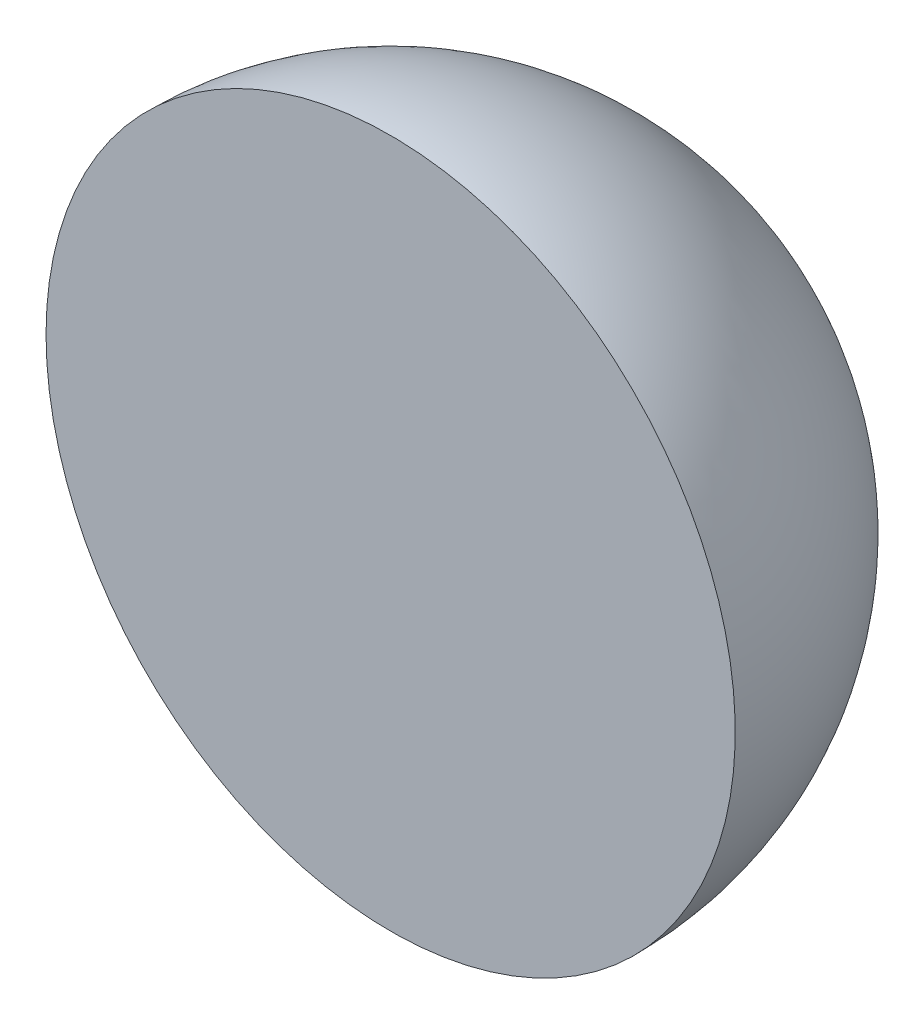
ISO-10303-21;
HEADER;
FILE_DESCRIPTION(('STEP AP214'),'2;1');
FILE_NAME('part.step','',(''),(''),'','','');
FILE_SCHEMA(('AUTOMOTIVE_DESIGN { 1 0 10303 214 1 1 1 1 }'));
ENDSEC;
DATA;
#1=APPLICATION_CONTEXT('core data for automotive mechanical design processes');
#2=APPLICATION_PROTOCOL_DEFINITION('international standard','automotive_design',2000,#1);
#3=PRODUCT_CONTEXT('',#1,'mechanical');
#4=PRODUCT('Part','Part','',(#3));
#5=PRODUCT_RELATED_PRODUCT_CATEGORY('part','',(#4));
#6=PRODUCT_DEFINITION_FORMATION('','',#4);
#7=PRODUCT_DEFINITION_CONTEXT('part definition',#1,'design');
#8=PRODUCT_DEFINITION('design','',#6,#7);
#9=PRODUCT_DEFINITION_SHAPE('','',#8);
#10=(LENGTH_UNIT() NAMED_UNIT(*) SI_UNIT(.MILLI.,.METRE.));
#11=(NAMED_UNIT(*) PLANE_ANGLE_UNIT() SI_UNIT($,.RADIAN.));
#12=(NAMED_UNIT(*) SI_UNIT($,.STERADIAN.) SOLID_ANGLE_UNIT());
#13=UNCERTAINTY_MEASURE_WITH_UNIT(LENGTH_MEASURE(1.E-05),#10,'distance_accuracy_value','');
#14=(GEOMETRIC_REPRESENTATION_CONTEXT(3) GLOBAL_UNCERTAINTY_ASSIGNED_CONTEXT((#13)) GLOBAL_UNIT_ASSIGNED_CONTEXT((#10,
#11,#12)) REPRESENTATION_CONTEXT('',''));
#15=CARTESIAN_POINT('',(0.,0.,0.));
#16=DIRECTION('',(0.,0.,1.));
#17=DIRECTION('',(1.,0.,0.));
#18=AXIS2_PLACEMENT_3D('',#15,#16,#17);
#19=CARTESIAN_POINT('',(-0.000140289903107632,0.,0.));
#20=DIRECTION('',(0.,-1.,0.));
#21=DIRECTION('',(-1.,0.,0.));
#22=AXIS2_PLACEMENT_3D('',#19,#20,#21);
#23=CIRCLE('',#22,4.99992985591816);
#24=TRIMMED_CURVE('',#23,(PARAMETER_VALUE(-1.57081035598202)),
(PARAMETER_VALUE(1.57081035598202)),.T.,.PARAMETER.);
#25=CARTESIAN_POINT('',(-7.0144951553816E-05,0.,0.));
#26=DIRECTION('',(0.,0.,-1.));
#27=AXIS1_PLACEMENT('',#25,#26);
#28=SURFACE_OF_REVOLUTION('',#24,#27);
#29=CARTESIAN_POINT('',(-7.01449515544284E-05,0.,-4.99992985542612));
#30=VERTEX_POINT('',#29);
#31=VERTEX_LOOP('',#30);
#32=FACE_BOUND('',#31,.T.);
#33=CARTESIAN_POINT('',(-7.01449515538161E-05,0.,-9.32578462613243E-05));
#34=DIRECTION('',(0.,0.,-1.));
#35=DIRECTION('',(-1.,0.,0.));
#36=AXIS2_PLACEMENT_3D('',#33,#34,#35);
#37=CIRCLE('',#36,5.);
#38=CARTESIAN_POINT('',(-5.00007014495155,0.,-9.32578462607119E-05));
#39=VERTEX_POINT('',#38);
#40=EDGE_CURVE('E11',#39,#39,#37,.T.);
#41=ORIENTED_EDGE('',*,*,#40,.T.);
#42=EDGE_LOOP('',(#41));
#43=FACE_BOUND('',#42,.T.);
#44=ADVANCED_FACE('F36',(#32,#43),#28,.T.);
#45=CARTESIAN_POINT('',(0.,0.,-9.32578462613623E-05));
#46=DIRECTION('',(0.,0.,1.));
#47=DIRECTION('',(1.,0.,0.));
#48=AXIS2_PLACEMENT_3D('',#45,#46,#47);
#49=PLANE('',#48);
#50=ORIENTED_EDGE('',*,*,#40,.F.);
#51=EDGE_LOOP('',(#50));
#52=FACE_BOUND('',#51,.T.);
#53=ADVANCED_FACE('F45',(#52),#49,.T.);
#54=CLOSED_SHELL('',(#44,#53));
#55=MANIFOLD_SOLID_BREP('B2',#54);
#56=ADVANCED_BREP_SHAPE_REPRESENTATION('',(#18,#55),#14);
#57=SHAPE_DEFINITION_REPRESENTATION(#9,#56);
ENDSEC;
END-ISO-10303-21;
